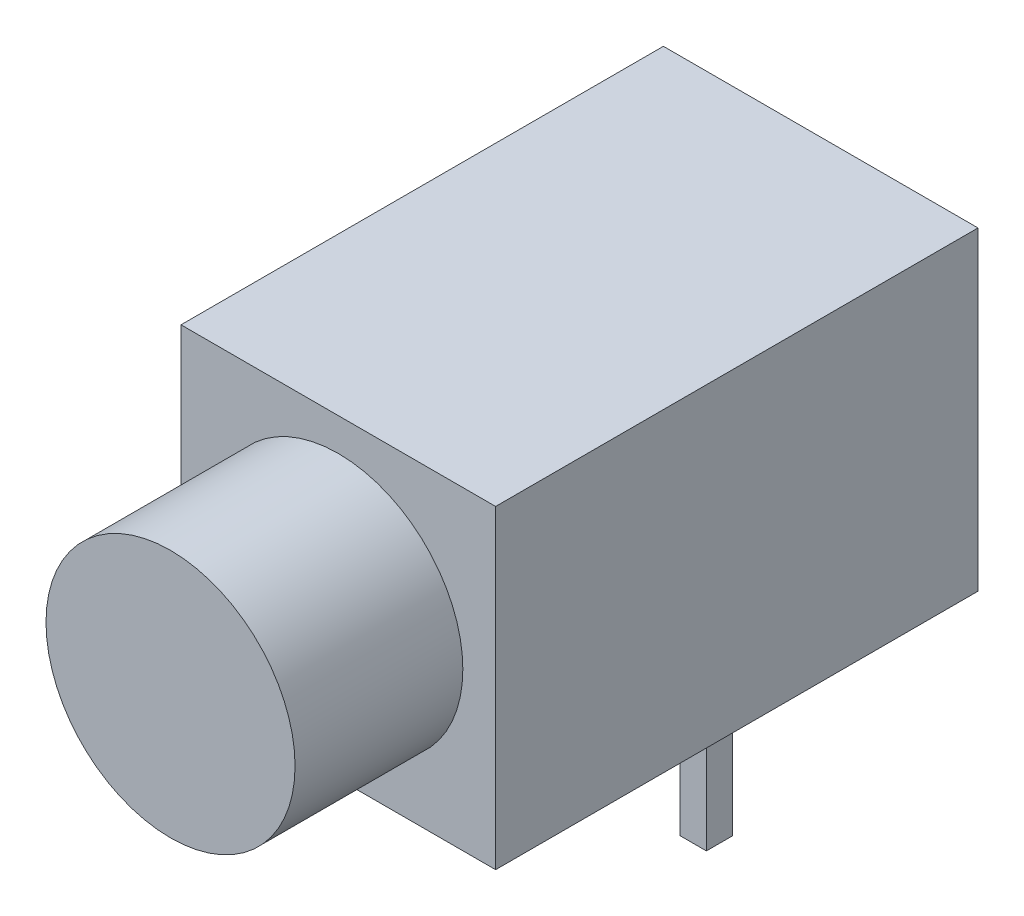
ISO-10303-21;
HEADER;
FILE_DESCRIPTION(('STEP AP214'),'2;1');
FILE_NAME('part.step','',(''),(''),'','','');
FILE_SCHEMA(('AUTOMOTIVE_DESIGN { 1 0 10303 214 1 1 1 1 }'));
ENDSEC;
DATA;
#1=APPLICATION_CONTEXT('core data for automotive mechanical design processes');
#2=APPLICATION_PROTOCOL_DEFINITION('international standard','automotive_design',2000,#1);
#3=PRODUCT_CONTEXT('',#1,'mechanical');
#4=PRODUCT('Part','Part','',(#3));
#5=PRODUCT_RELATED_PRODUCT_CATEGORY('part','',(#4));
#6=PRODUCT_DEFINITION_FORMATION('','',#4);
#7=PRODUCT_DEFINITION_CONTEXT('part definition',#1,'design');
#8=PRODUCT_DEFINITION('design','',#6,#7);
#9=PRODUCT_DEFINITION_SHAPE('','',#8);
#10=(LENGTH_UNIT() NAMED_UNIT(*) SI_UNIT(.MILLI.,.METRE.));
#11=(NAMED_UNIT(*) PLANE_ANGLE_UNIT() SI_UNIT($,.RADIAN.));
#12=(NAMED_UNIT(*) SI_UNIT($,.STERADIAN.) SOLID_ANGLE_UNIT());
#13=UNCERTAINTY_MEASURE_WITH_UNIT(LENGTH_MEASURE(1.E-05),#10,'distance_accuracy_value','');
#14=(GEOMETRIC_REPRESENTATION_CONTEXT(3) GLOBAL_UNCERTAINTY_ASSIGNED_CONTEXT((#13)) GLOBAL_UNIT_ASSIGNED_CONTEXT((#10,
#11,#12)) REPRESENTATION_CONTEXT('',''));
#15=CARTESIAN_POINT('',(0.,0.,0.));
#16=DIRECTION('',(0.,0.,1.));
#17=DIRECTION('',(1.,0.,0.));
#18=AXIS2_PLACEMENT_3D('',#15,#16,#17);
#19=CARTESIAN_POINT('',(0.,0.,0.));
#20=DIRECTION('',(0.,1.,0.));
#21=DIRECTION('',(0.,0.,1.));
#22=AXIS2_PLACEMENT_3D('',#19,#20,#21);
#23=PLANE('',#22);
#24=DIRECTION('',(0.,0.,-1.));
#25=VECTOR('',#24,1.);
#26=CARTESIAN_POINT('',(1.48,0.,-6.));
#27=LINE('',#26,#25);
#28=CARTESIAN_POINT('',(1.48,0.,-5.5));
#29=VERTEX_POINT('',#28);
#30=CARTESIAN_POINT('',(1.48,0.,-6.));
#31=VERTEX_POINT('',#30);
#32=EDGE_CURVE('E135',#29,#31,#27,.T.);
#33=ORIENTED_EDGE('',*,*,#32,.F.);
#34=DIRECTION('',(-1.,0.,0.));
#35=VECTOR('',#34,1.);
#36=CARTESIAN_POINT('',(1.48,0.,-5.5));
#37=LINE('',#36,#35);
#38=CARTESIAN_POINT('',(1.98,0.,-5.5));
#39=VERTEX_POINT('',#38);
#40=EDGE_CURVE('E179',#39,#29,#37,.T.);
#41=ORIENTED_EDGE('',*,*,#40,.F.);
#42=DIRECTION('',(0.,0.,1.));
#43=VECTOR('',#42,1.);
#44=CARTESIAN_POINT('',(1.98,0.,-6.));
#45=LINE('',#44,#43);
#46=CARTESIAN_POINT('',(1.98,0.,-6.));
#47=VERTEX_POINT('',#46);
#48=EDGE_CURVE('E196',#47,#39,#45,.T.);
#49=ORIENTED_EDGE('',*,*,#48,.F.);
#50=DIRECTION('',(1.,0.,0.));
#51=VECTOR('',#50,1.);
#52=CARTESIAN_POINT('',(1.48,0.,-6.));
#53=LINE('',#52,#51);
#54=EDGE_CURVE('E192',#31,#47,#53,.T.);
#55=ORIENTED_EDGE('',*,*,#54,.F.);
#56=EDGE_LOOP('',(#33,#41,#49,#55));
#57=FACE_BOUND('',#56,.T.);
#58=DIRECTION('',(1.,0.,0.));
#59=VECTOR('',#58,1.);
#60=CARTESIAN_POINT('',(0.,0.,-9.2));
#61=LINE('',#60,#59);
#62=CARTESIAN_POINT('',(0.,0.,-9.2));
#63=VERTEX_POINT('',#62);
#64=CARTESIAN_POINT('',(6.,0.,-9.2));
#65=VERTEX_POINT('',#64);
#66=EDGE_CURVE('E220',#63,#65,#61,.T.);
#67=ORIENTED_EDGE('',*,*,#66,.T.);
#68=DIRECTION('',(0.,0.,-1.));
#69=VECTOR('',#68,1.);
#70=CARTESIAN_POINT('',(6.,0.,0.));
#71=LINE('',#70,#69);
#72=CARTESIAN_POINT('',(6.,0.,0.));
#73=VERTEX_POINT('',#72);
#74=EDGE_CURVE('E240',#73,#65,#71,.T.);
#75=ORIENTED_EDGE('',*,*,#74,.F.);
#76=DIRECTION('',(1.,0.,0.));
#77=VECTOR('',#76,1.);
#78=CARTESIAN_POINT('',(0.,0.,0.));
#79=LINE('',#78,#77);
#80=CARTESIAN_POINT('',(0.,0.,0.));
#81=VERTEX_POINT('',#80);
#82=EDGE_CURVE('E244',#81,#73,#79,.T.);
#83=ORIENTED_EDGE('',*,*,#82,.F.);
#84=DIRECTION('',(0.,0.,-1.));
#85=VECTOR('',#84,1.);
#86=CARTESIAN_POINT('',(0.,0.,0.));
#87=LINE('',#86,#85);
#88=EDGE_CURVE('E227',#81,#63,#87,.T.);
#89=ORIENTED_EDGE('',*,*,#88,.T.);
#90=EDGE_LOOP('',(#67,#75,#83,#89));
#91=FACE_BOUND('',#90,.T.);
#92=DIRECTION('',(0.,0.,-1.));
#93=VECTOR('',#92,1.);
#94=CARTESIAN_POINT('',(4.02,0.,-6.));
#95=LINE('',#94,#93);
#96=CARTESIAN_POINT('',(4.02,0.,-5.5));
#97=VERTEX_POINT('',#96);
#98=CARTESIAN_POINT('',(4.02,0.,-6.));
#99=VERTEX_POINT('',#98);
#100=EDGE_CURVE('E128',#97,#99,#95,.T.);
#101=ORIENTED_EDGE('',*,*,#100,.F.);
#102=DIRECTION('',(-1.,0.,0.));
#103=VECTOR('',#102,1.);
#104=CARTESIAN_POINT('',(4.02,0.,-5.5));
#105=LINE('',#104,#103);
#106=CARTESIAN_POINT('',(4.52,0.,-5.5));
#107=VERTEX_POINT('',#106);
#108=EDGE_CURVE('E130',#107,#97,#105,.T.);
#109=ORIENTED_EDGE('',*,*,#108,.F.);
#110=DIRECTION('',(0.,0.,1.));
#111=VECTOR('',#110,1.);
#112=CARTESIAN_POINT('',(4.52,0.,-6.));
#113=LINE('',#112,#111);
#114=CARTESIAN_POINT('',(4.52,0.,-6.));
#115=VERTEX_POINT('',#114);
#116=EDGE_CURVE('E63',#115,#107,#113,.T.);
#117=ORIENTED_EDGE('',*,*,#116,.F.);
#118=DIRECTION('',(1.,0.,0.));
#119=VECTOR('',#118,1.);
#120=CARTESIAN_POINT('',(4.02,0.,-6.));
#121=LINE('',#120,#119);
#122=EDGE_CURVE('E58',#99,#115,#121,.T.);
#123=ORIENTED_EDGE('',*,*,#122,.F.);
#124=EDGE_LOOP('',(#101,#109,#117,#123));
#125=FACE_BOUND('',#124,.T.);
#126=ADVANCED_FACE('F40',(#57,#91,#125),#23,.F.);
#127=CARTESIAN_POINT('',(0.,6.,-9.2));
#128=DIRECTION('',(0.,0.,-1.));
#129=DIRECTION('',(-1.,0.,0.));
#130=AXIS2_PLACEMENT_3D('',#127,#128,#129);
#131=PLANE('',#130);
#132=ORIENTED_EDGE('',*,*,#66,.F.);
#133=DIRECTION('',(0.,-1.,0.));
#134=VECTOR('',#133,1.);
#135=CARTESIAN_POINT('',(0.,6.,-9.2));
#136=LINE('',#135,#134);
#137=CARTESIAN_POINT('',(0.,6.,-9.2));
#138=VERTEX_POINT('',#137);
#139=EDGE_CURVE('E50',#138,#63,#136,.T.);
#140=ORIENTED_EDGE('',*,*,#139,.F.);
#141=DIRECTION('',(1.,0.,0.));
#142=VECTOR('',#141,1.);
#143=CARTESIAN_POINT('',(0.,6.,-9.2));
#144=LINE('',#143,#142);
#145=CARTESIAN_POINT('',(6.,6.,-9.2));
#146=VERTEX_POINT('',#145);
#147=EDGE_CURVE('E222',#138,#146,#144,.T.);
#148=ORIENTED_EDGE('',*,*,#147,.T.);
#149=DIRECTION('',(0.,-1.,0.));
#150=VECTOR('',#149,1.);
#151=CARTESIAN_POINT('',(6.,6.,-9.2));
#152=LINE('',#151,#150);
#153=EDGE_CURVE('E44',#146,#65,#152,.T.);
#154=ORIENTED_EDGE('',*,*,#153,.T.);
#155=EDGE_LOOP('',(#132,#140,#148,#154));
#156=FACE_BOUND('',#155,.T.);
#157=ADVANCED_FACE('F42',(#156),#131,.T.);
#158=CARTESIAN_POINT('',(0.,6.,0.));
#159=DIRECTION('',(-1.,0.,0.));
#160=DIRECTION('',(0.,0.,1.));
#161=AXIS2_PLACEMENT_3D('',#158,#159,#160);
#162=PLANE('',#161);
#163=ORIENTED_EDGE('',*,*,#88,.F.);
#164=DIRECTION('',(0.,-1.,0.));
#165=VECTOR('',#164,1.);
#166=CARTESIAN_POINT('',(0.,6.,0.));
#167=LINE('',#166,#165);
#168=CARTESIAN_POINT('',(0.,6.,0.));
#169=VERTEX_POINT('',#168);
#170=EDGE_CURVE('E252',#169,#81,#167,.T.);
#171=ORIENTED_EDGE('',*,*,#170,.F.);
#172=DIRECTION('',(0.,0.,-1.));
#173=VECTOR('',#172,1.);
#174=CARTESIAN_POINT('',(0.,6.,0.));
#175=LINE('',#174,#173);
#176=EDGE_CURVE('E233',#169,#138,#175,.T.);
#177=ORIENTED_EDGE('',*,*,#176,.T.);
#178=ORIENTED_EDGE('',*,*,#139,.T.);
#179=EDGE_LOOP('',(#163,#171,#177,#178));
#180=FACE_BOUND('',#179,.T.);
#181=ADVANCED_FACE('F271',(#180),#162,.T.);
#182=CARTESIAN_POINT('',(0.,6.,0.));
#183=DIRECTION('',(0.,0.,-1.));
#184=DIRECTION('',(-1.,0.,0.));
#185=AXIS2_PLACEMENT_3D('',#182,#183,#184);
#186=PLANE('',#185);
#187=CARTESIAN_POINT('',(3.,3.,0.));
#188=DIRECTION('',(0.,0.,1.));
#189=DIRECTION('',(1.,0.,0.));
#190=AXIS2_PLACEMENT_3D('',#187,#188,#189);
#191=CIRCLE('',#190,2.375);
#192=CARTESIAN_POINT('',(5.375,3.,0.));
#193=VERTEX_POINT('',#192);
#194=EDGE_CURVE('E11',#193,#193,#191,.T.);
#195=ORIENTED_EDGE('',*,*,#194,.F.);
#196=EDGE_LOOP('',(#195));
#197=FACE_BOUND('',#196,.T.);
#198=ORIENTED_EDGE('',*,*,#82,.T.);
#199=DIRECTION('',(0.,-1.,0.));
#200=VECTOR('',#199,1.);
#201=CARTESIAN_POINT('',(6.,6.,0.));
#202=LINE('',#201,#200);
#203=CARTESIAN_POINT('',(6.,6.,0.));
#204=VERTEX_POINT('',#203);
#205=EDGE_CURVE('E254',#204,#73,#202,.T.);
#206=ORIENTED_EDGE('',*,*,#205,.F.);
#207=DIRECTION('',(1.,0.,0.));
#208=VECTOR('',#207,1.);
#209=CARTESIAN_POINT('',(0.,6.,0.));
#210=LINE('',#209,#208);
#211=EDGE_CURVE('E230',#169,#204,#210,.T.);
#212=ORIENTED_EDGE('',*,*,#211,.F.);
#213=ORIENTED_EDGE('',*,*,#170,.T.);
#214=EDGE_LOOP('',(#198,#206,#212,#213));
#215=FACE_BOUND('',#214,.T.);
#216=ADVANCED_FACE('F277',(#197,#215),#186,.F.);
#217=CARTESIAN_POINT('',(6.,6.,0.));
#218=DIRECTION('',(-1.,0.,0.));
#219=DIRECTION('',(0.,0.,1.));
#220=AXIS2_PLACEMENT_3D('',#217,#218,#219);
#221=PLANE('',#220);
#222=ORIENTED_EDGE('',*,*,#74,.T.);
#223=ORIENTED_EDGE('',*,*,#153,.F.);
#224=DIRECTION('',(0.,0.,-1.));
#225=VECTOR('',#224,1.);
#226=CARTESIAN_POINT('',(6.,6.,0.));
#227=LINE('',#226,#225);
#228=EDGE_CURVE('E226',#204,#146,#227,.T.);
#229=ORIENTED_EDGE('',*,*,#228,.F.);
#230=ORIENTED_EDGE('',*,*,#205,.T.);
#231=EDGE_LOOP('',(#222,#223,#229,#230));
#232=FACE_BOUND('',#231,.T.);
#233=ADVANCED_FACE('F266',(#232),#221,.F.);
#234=CARTESIAN_POINT('',(0.,6.,0.));
#235=DIRECTION('',(0.,1.,0.));
#236=DIRECTION('',(0.,0.,1.));
#237=AXIS2_PLACEMENT_3D('',#234,#235,#236);
#238=PLANE('',#237);
#239=ORIENTED_EDGE('',*,*,#147,.F.);
#240=ORIENTED_EDGE('',*,*,#176,.F.);
#241=ORIENTED_EDGE('',*,*,#211,.T.);
#242=ORIENTED_EDGE('',*,*,#228,.T.);
#243=EDGE_LOOP('',(#239,#240,#241,#242));
#244=FACE_BOUND('',#243,.T.);
#245=ADVANCED_FACE('F275',(#244),#238,.T.);
#246=CARTESIAN_POINT('',(3.,3.,3.2));
#247=DIRECTION('',(0.,0.,-1.));
#248=DIRECTION('',(-1.,0.,0.));
#249=AXIS2_PLACEMENT_3D('',#246,#247,#248);
#250=CYLINDRICAL_SURFACE('',#249,2.375);
#251=CARTESIAN_POINT('',(3.,3.,3.2));
#252=DIRECTION('',(0.,0.,1.));
#253=DIRECTION('',(1.,0.,0.));
#254=AXIS2_PLACEMENT_3D('',#251,#252,#253);
#255=CIRCLE('',#254,2.375);
#256=CARTESIAN_POINT('',(5.375,3.,3.2));
#257=VERTEX_POINT('',#256);
#258=EDGE_CURVE('E217',#257,#257,#255,.T.);
#259=ORIENTED_EDGE('',*,*,#258,.F.);
#260=EDGE_LOOP('',(#259));
#261=FACE_BOUND('',#260,.T.);
#262=ORIENTED_EDGE('',*,*,#194,.T.);
#263=EDGE_LOOP('',(#262));
#264=FACE_BOUND('',#263,.T.);
#265=ADVANCED_FACE('F296',(#261,#264),#250,.T.);
#266=CARTESIAN_POINT('',(3.,3.,3.2));
#267=DIRECTION('',(0.,0.,1.));
#268=DIRECTION('',(1.,0.,0.));
#269=AXIS2_PLACEMENT_3D('',#266,#267,#268);
#270=PLANE('',#269);
#271=ORIENTED_EDGE('',*,*,#258,.T.);
#272=EDGE_LOOP('',(#271));
#273=FACE_BOUND('',#272,.T.);
#274=ADVANCED_FACE('F299',(#273),#270,.T.);
#275=CARTESIAN_POINT('',(1.48,-3.18,-6.));
#276=DIRECTION('',(1.,0.,0.));
#277=DIRECTION('',(0.,0.,-1.));
#278=AXIS2_PLACEMENT_3D('',#275,#276,#277);
#279=PLANE('',#278);
#280=ORIENTED_EDGE('',*,*,#32,.T.);
#281=DIRECTION('',(0.,1.,0.));
#282=VECTOR('',#281,1.);
#283=CARTESIAN_POINT('',(1.48,-3.18,-6.));
#284=LINE('',#283,#282);
#285=CARTESIAN_POINT('',(1.48,-3.18,-6.));
#286=VERTEX_POINT('',#285);
#287=EDGE_CURVE('E213',#286,#31,#284,.T.);
#288=ORIENTED_EDGE('',*,*,#287,.F.);
#289=DIRECTION('',(0.,0.,-1.));
#290=VECTOR('',#289,1.);
#291=CARTESIAN_POINT('',(1.48,-3.18,-6.));
#292=LINE('',#291,#290);
#293=CARTESIAN_POINT('',(1.48,-3.18,-5.5));
#294=VERTEX_POINT('',#293);
#295=EDGE_CURVE('E174',#294,#286,#292,.T.);
#296=ORIENTED_EDGE('',*,*,#295,.F.);
#297=DIRECTION('',(0.,1.,0.));
#298=VECTOR('',#297,1.);
#299=CARTESIAN_POINT('',(1.48,-3.18,-5.5));
#300=LINE('',#299,#298);
#301=EDGE_CURVE('E188',#294,#29,#300,.T.);
#302=ORIENTED_EDGE('',*,*,#301,.T.);
#303=EDGE_LOOP('',(#280,#288,#296,#302));
#304=FACE_BOUND('',#303,.T.);
#305=ADVANCED_FACE('F303',(#304),#279,.F.);
#306=CARTESIAN_POINT('',(1.48,-3.18,-6.));
#307=DIRECTION('',(0.,0.,1.));
#308=DIRECTION('',(1.,0.,0.));
#309=AXIS2_PLACEMENT_3D('',#306,#307,#308);
#310=PLANE('',#309);
#311=ORIENTED_EDGE('',*,*,#54,.T.);
#312=DIRECTION('',(0.,1.,0.));
#313=VECTOR('',#312,1.);
#314=CARTESIAN_POINT('',(1.98,-3.18,-6.));
#315=LINE('',#314,#313);
#316=CARTESIAN_POINT('',(1.98,-3.18,-6.));
#317=VERTEX_POINT('',#316);
#318=EDGE_CURVE('E209',#317,#47,#315,.T.);
#319=ORIENTED_EDGE('',*,*,#318,.F.);
#320=DIRECTION('',(1.,0.,0.));
#321=VECTOR('',#320,1.);
#322=CARTESIAN_POINT('',(1.48,-3.18,-6.));
#323=LINE('',#322,#321);
#324=EDGE_CURVE('E178',#286,#317,#323,.T.);
#325=ORIENTED_EDGE('',*,*,#324,.F.);
#326=ORIENTED_EDGE('',*,*,#287,.T.);
#327=EDGE_LOOP('',(#311,#319,#325,#326));
#328=FACE_BOUND('',#327,.T.);
#329=ADVANCED_FACE('F307',(#328),#310,.F.);
#330=CARTESIAN_POINT('',(1.98,-3.18,-6.));
#331=DIRECTION('',(-1.,0.,0.));
#332=DIRECTION('',(0.,0.,1.));
#333=AXIS2_PLACEMENT_3D('',#330,#331,#332);
#334=PLANE('',#333);
#335=ORIENTED_EDGE('',*,*,#48,.T.);
#336=DIRECTION('',(0.,1.,0.));
#337=VECTOR('',#336,1.);
#338=CARTESIAN_POINT('',(1.98,-3.18,-5.5));
#339=LINE('',#338,#337);
#340=CARTESIAN_POINT('',(1.98,-3.18,-5.5));
#341=VERTEX_POINT('',#340);
#342=EDGE_CURVE('E205',#341,#39,#339,.T.);
#343=ORIENTED_EDGE('',*,*,#342,.F.);
#344=DIRECTION('',(0.,0.,1.));
#345=VECTOR('',#344,1.);
#346=CARTESIAN_POINT('',(1.98,-3.18,-6.));
#347=LINE('',#346,#345);
#348=EDGE_CURVE('E182',#317,#341,#347,.T.);
#349=ORIENTED_EDGE('',*,*,#348,.F.);
#350=ORIENTED_EDGE('',*,*,#318,.T.);
#351=EDGE_LOOP('',(#335,#343,#349,#350));
#352=FACE_BOUND('',#351,.T.);
#353=ADVANCED_FACE('F311',(#352),#334,.F.);
#354=CARTESIAN_POINT('',(1.48,-3.18,-5.5));
#355=DIRECTION('',(0.,0.,-1.));
#356=DIRECTION('',(-1.,0.,0.));
#357=AXIS2_PLACEMENT_3D('',#354,#355,#356);
#358=PLANE('',#357);
#359=ORIENTED_EDGE('',*,*,#40,.T.);
#360=ORIENTED_EDGE('',*,*,#301,.F.);
#361=DIRECTION('',(-1.,0.,0.));
#362=VECTOR('',#361,1.);
#363=CARTESIAN_POINT('',(1.48,-3.18,-5.5));
#364=LINE('',#363,#362);
#365=EDGE_CURVE('E185',#341,#294,#364,.T.);
#366=ORIENTED_EDGE('',*,*,#365,.F.);
#367=ORIENTED_EDGE('',*,*,#342,.T.);
#368=EDGE_LOOP('',(#359,#360,#366,#367));
#369=FACE_BOUND('',#368,.T.);
#370=ADVANCED_FACE('F315',(#369),#358,.F.);
#371=CARTESIAN_POINT('',(0.,-3.18,0.));
#372=DIRECTION('',(0.,1.,0.));
#373=DIRECTION('',(0.,0.,1.));
#374=AXIS2_PLACEMENT_3D('',#371,#372,#373);
#375=PLANE('',#374);
#376=ORIENTED_EDGE('',*,*,#295,.T.);
#377=ORIENTED_EDGE('',*,*,#324,.T.);
#378=ORIENTED_EDGE('',*,*,#348,.T.);
#379=ORIENTED_EDGE('',*,*,#365,.T.);
#380=EDGE_LOOP('',(#376,#377,#378,#379));
#381=FACE_BOUND('',#380,.T.);
#382=ADVANCED_FACE('F319',(#381),#375,.F.);
#383=CARTESIAN_POINT('',(4.02,-3.18,-6.));
#384=DIRECTION('',(1.,0.,0.));
#385=DIRECTION('',(0.,0.,-1.));
#386=AXIS2_PLACEMENT_3D('',#383,#384,#385);
#387=PLANE('',#386);
#388=ORIENTED_EDGE('',*,*,#100,.T.);
#389=DIRECTION('',(0.,1.,0.));
#390=VECTOR('',#389,1.);
#391=CARTESIAN_POINT('',(4.02,-3.18,-6.));
#392=LINE('',#391,#390);
#393=CARTESIAN_POINT('',(4.02,-3.18,-6.));
#394=VERTEX_POINT('',#393);
#395=EDGE_CURVE('E500',#394,#99,#392,.T.);
#396=ORIENTED_EDGE('',*,*,#395,.F.);
#397=DIRECTION('',(0.,0.,-1.));
#398=VECTOR('',#397,1.);
#399=CARTESIAN_POINT('',(4.02,-3.18,-6.));
#400=LINE('',#399,#398);
#401=CARTESIAN_POINT('',(4.02,-3.18,-5.5));
#402=VERTEX_POINT('',#401);
#403=EDGE_CURVE('E147',#402,#394,#400,.T.);
#404=ORIENTED_EDGE('',*,*,#403,.F.);
#405=DIRECTION('',(0.,1.,0.));
#406=VECTOR('',#405,1.);
#407=CARTESIAN_POINT('',(4.02,-3.18,-5.5));
#408=LINE('',#407,#406);
#409=EDGE_CURVE('E142',#402,#97,#408,.T.);
#410=ORIENTED_EDGE('',*,*,#409,.T.);
#411=EDGE_LOOP('',(#388,#396,#404,#410));
#412=FACE_BOUND('',#411,.T.);
#413=ADVANCED_FACE('F149',(#412),#387,.F.);
#414=CARTESIAN_POINT('',(4.02,-3.18,-6.));
#415=DIRECTION('',(0.,0.,1.));
#416=DIRECTION('',(1.,0.,0.));
#417=AXIS2_PLACEMENT_3D('',#414,#415,#416);
#418=PLANE('',#417);
#419=ORIENTED_EDGE('',*,*,#122,.T.);
#420=DIRECTION('',(0.,1.,0.));
#421=VECTOR('',#420,1.);
#422=CARTESIAN_POINT('',(4.52,-3.18,-6.));
#423=LINE('',#422,#421);
#424=CARTESIAN_POINT('',(4.52,-3.18,-6.));
#425=VERTEX_POINT('',#424);
#426=EDGE_CURVE('E159',#425,#115,#423,.T.);
#427=ORIENTED_EDGE('',*,*,#426,.F.);
#428=DIRECTION('',(1.,0.,0.));
#429=VECTOR('',#428,1.);
#430=CARTESIAN_POINT('',(4.02,-3.18,-6.));
#431=LINE('',#430,#429);
#432=EDGE_CURVE('E169',#394,#425,#431,.T.);
#433=ORIENTED_EDGE('',*,*,#432,.F.);
#434=ORIENTED_EDGE('',*,*,#395,.T.);
#435=EDGE_LOOP('',(#419,#427,#433,#434));
#436=FACE_BOUND('',#435,.T.);
#437=ADVANCED_FACE('F333',(#436),#418,.F.);
#438=CARTESIAN_POINT('',(4.52,-3.18,-6.));
#439=DIRECTION('',(-1.,0.,0.));
#440=DIRECTION('',(0.,0.,1.));
#441=AXIS2_PLACEMENT_3D('',#438,#439,#440);
#442=PLANE('',#441);
#443=ORIENTED_EDGE('',*,*,#116,.T.);
#444=DIRECTION('',(0.,1.,0.));
#445=VECTOR('',#444,1.);
#446=CARTESIAN_POINT('',(4.52,-3.18,-5.5));
#447=LINE('',#446,#445);
#448=CARTESIAN_POINT('',(4.52,-3.18,-5.5));
#449=VERTEX_POINT('',#448);
#450=EDGE_CURVE('E145',#449,#107,#447,.T.);
#451=ORIENTED_EDGE('',*,*,#450,.F.);
#452=DIRECTION('',(0.,0.,1.));
#453=VECTOR('',#452,1.);
#454=CARTESIAN_POINT('',(4.52,-3.18,-6.));
#455=LINE('',#454,#453);
#456=EDGE_CURVE('E156',#425,#449,#455,.T.);
#457=ORIENTED_EDGE('',*,*,#456,.F.);
#458=ORIENTED_EDGE('',*,*,#426,.T.);
#459=EDGE_LOOP('',(#443,#451,#457,#458));
#460=FACE_BOUND('',#459,.T.);
#461=ADVANCED_FACE('F330',(#460),#442,.F.);
#462=CARTESIAN_POINT('',(4.02,-3.18,-5.5));
#463=DIRECTION('',(0.,0.,-1.));
#464=DIRECTION('',(-1.,0.,0.));
#465=AXIS2_PLACEMENT_3D('',#462,#463,#464);
#466=PLANE('',#465);
#467=ORIENTED_EDGE('',*,*,#108,.T.);
#468=ORIENTED_EDGE('',*,*,#409,.F.);
#469=DIRECTION('',(-1.,0.,0.));
#470=VECTOR('',#469,1.);
#471=CARTESIAN_POINT('',(4.02,-3.18,-5.5));
#472=LINE('',#471,#470);
#473=EDGE_CURVE('E152',#449,#402,#472,.T.);
#474=ORIENTED_EDGE('',*,*,#473,.F.);
#475=ORIENTED_EDGE('',*,*,#450,.T.);
#476=EDGE_LOOP('',(#467,#468,#474,#475));
#477=FACE_BOUND('',#476,.T.);
#478=ADVANCED_FACE('F140',(#477),#466,.F.);
#479=CARTESIAN_POINT('',(0.,-3.18,0.));
#480=DIRECTION('',(0.,1.,0.));
#481=DIRECTION('',(0.,0.,1.));
#482=AXIS2_PLACEMENT_3D('',#479,#480,#481);
#483=PLANE('',#482);
#484=ORIENTED_EDGE('',*,*,#403,.T.);
#485=ORIENTED_EDGE('',*,*,#432,.T.);
#486=ORIENTED_EDGE('',*,*,#456,.T.);
#487=ORIENTED_EDGE('',*,*,#473,.T.);
#488=EDGE_LOOP('',(#484,#485,#486,#487));
#489=FACE_BOUND('',#488,.T.);
#490=ADVANCED_FACE('F324',(#489),#483,.F.);
#491=CLOSED_SHELL('',(#126,#157,#181,#216,#233,#245,#265,#274,#305,#329,#353,#370,#382,#413,
#437,#461,#478,#490));
#492=MANIFOLD_SOLID_BREP('B2',#491);
#493=ADVANCED_BREP_SHAPE_REPRESENTATION('',(#18,#492),#14);
#494=SHAPE_DEFINITION_REPRESENTATION(#9,#493);
ENDSEC;
END-ISO-10303-21;
